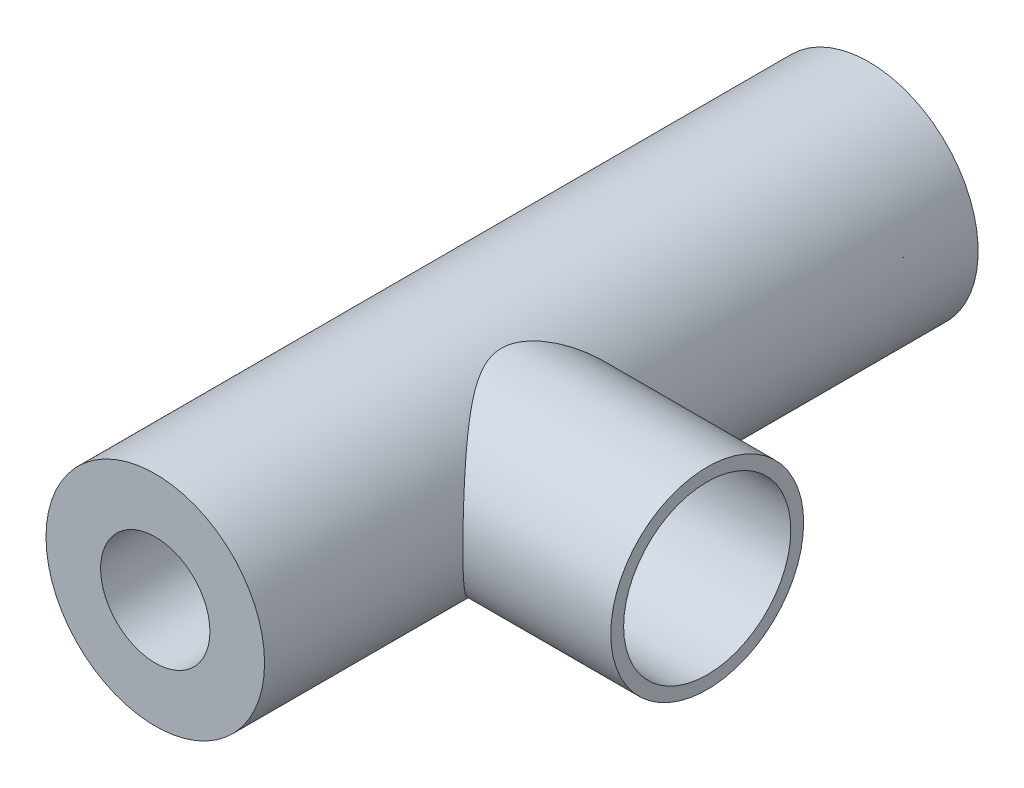
ISO-10303-21;
HEADER;
FILE_DESCRIPTION(('STEP AP214'),'2;1');
FILE_NAME('part.step','',(''),(''),'','','');
FILE_SCHEMA(('AUTOMOTIVE_DESIGN { 1 0 10303 214 1 1 1 1 }'));
ENDSEC;
DATA;
#1=APPLICATION_CONTEXT('core data for automotive mechanical design processes');
#2=APPLICATION_PROTOCOL_DEFINITION('international standard','automotive_design',2000,#1);
#3=PRODUCT_CONTEXT('',#1,'mechanical');
#4=PRODUCT('Part','Part','',(#3));
#5=PRODUCT_RELATED_PRODUCT_CATEGORY('part','',(#4));
#6=PRODUCT_DEFINITION_FORMATION('','',#4);
#7=PRODUCT_DEFINITION_CONTEXT('part definition',#1,'design');
#8=PRODUCT_DEFINITION('design','',#6,#7);
#9=PRODUCT_DEFINITION_SHAPE('','',#8);
#10=(LENGTH_UNIT() NAMED_UNIT(*) SI_UNIT(.MILLI.,.METRE.));
#11=(NAMED_UNIT(*) PLANE_ANGLE_UNIT() SI_UNIT($,.RADIAN.));
#12=(NAMED_UNIT(*) SI_UNIT($,.STERADIAN.) SOLID_ANGLE_UNIT());
#13=UNCERTAINTY_MEASURE_WITH_UNIT(LENGTH_MEASURE(1.E-05),#10,'distance_accuracy_value','');
#14=(GEOMETRIC_REPRESENTATION_CONTEXT(3) GLOBAL_UNCERTAINTY_ASSIGNED_CONTEXT((#13)) GLOBAL_UNIT_ASSIGNED_CONTEXT((#10,
#11,#12)) REPRESENTATION_CONTEXT('',''));
#15=CARTESIAN_POINT('',(0.,0.,0.));
#16=DIRECTION('',(0.,0.,1.));
#17=DIRECTION('',(1.,0.,0.));
#18=AXIS2_PLACEMENT_3D('',#15,#16,#17);
#19=CARTESIAN_POINT('',(0.,0.,40.));
#20=DIRECTION('',(0.,0.,-1.));
#21=DIRECTION('',(-1.,0.,0.));
#22=AXIS2_PLACEMENT_3D('',#19,#20,#21);
#23=CYLINDRICAL_SURFACE('',#22,17.);
#24=CARTESIAN_POINT('',(17.,0.,35.148533521579));
#25=CARTESIAN_POINT('',(16.9999991302981,-0.350062969028345,35.1485326365752));
#26=CARTESIAN_POINT('',(16.9891653444857,-0.700137947487223,35.1362576028503));
#27=CARTESIAN_POINT('',(16.9460807365506,-1.39725887284022,35.0874017384682));
#28=CARTESIAN_POINT('',(16.9138288534935,-1.74430466882253,35.0508197037761));
#29=CARTESIAN_POINT('',(16.8286230490111,-2.43264872335066,34.9540419460553));
#30=CARTESIAN_POINT('',(16.7756599565189,-2.77394436575743,34.8938357620491));
#31=CARTESIAN_POINT('',(16.6501724362022,-3.4480913826469,34.7509104252288));
#32=CARTESIAN_POINT('',(16.5776478083794,-3.78094267075591,34.6681910422382));
#33=CARTESIAN_POINT('',(16.4149921748408,-4.43402605306581,34.4821997809237));
#34=CARTESIAN_POINT('',(16.3249739977953,-4.75432399503505,34.379059535401));
#35=CARTESIAN_POINT('',(16.1286563009096,-5.38282947299204,34.1534129336591));
#36=CARTESIAN_POINT('',(16.0223571596618,-5.69103728991045,34.0309070277607));
#37=CARTESIAN_POINT('',(15.7951549284394,-6.29420048565358,33.7680522317252));
#38=CARTESIAN_POINT('',(15.6742496032193,-6.5891538265906,33.6277006104105));
#39=CARTESIAN_POINT('',(15.4195507686398,-7.16495750260025,33.3306571284931));
#40=CARTESIAN_POINT('',(15.2857544012181,-7.44580468911481,33.173961643667));
#41=CARTESIAN_POINT('',(14.9525647573555,-8.09955996417689,32.7815759695317));
#42=CARTESIAN_POINT('',(14.7479422301565,-8.46564473889133,32.5389147038629));
#43=CARTESIAN_POINT('',(14.3214041581488,-9.16878467175514,32.0280287184052));
#44=CARTESIAN_POINT('',(14.0994823766256,-9.50582926730369,31.7597947713264));
#45=CARTESIAN_POINT('',(13.6420314172314,-10.1514445290334,31.1998314355125));
#46=CARTESIAN_POINT('',(13.4064727396035,-10.4599494069001,30.9080505283112));
#47=CARTESIAN_POINT('',(12.9263257225329,-11.0478102432138,30.3035156680166));
#48=CARTESIAN_POINT('',(12.6817385891012,-11.3271700758846,29.9907645115816));
#49=CARTESIAN_POINT('',(12.1822165195919,-11.862995920558,29.3382831989957));
#50=CARTESIAN_POINT('',(11.9271723672962,-12.118818678642,28.9981092375766));
#51=CARTESIAN_POINT('',(11.416843540912,-12.6007468771702,28.2972835695232));
#52=CARTESIAN_POINT('',(11.1615588172992,-12.8268432683654,27.936625674831));
#53=CARTESIAN_POINT('',(10.6573293126381,-13.2487415055619,27.1949915507721));
#54=CARTESIAN_POINT('',(10.4083734410591,-13.4445999098557,26.814055091824));
#55=CARTESIAN_POINT('',(9.92433695372352,-13.8057374904692,26.0296892610917));
#56=CARTESIAN_POINT('',(9.6892463012846,-13.9710389758638,25.6262765810827));
#57=CARTESIAN_POINT('',(9.35346771382335,-14.1961760706847,24.9981919900579));
#58=CARTESIAN_POINT('',(9.24338032322282,-14.2679936455798,24.782824941109));
#59=CARTESIAN_POINT('',(9.03189446245701,-14.4027986616648,24.3451915706748));
#60=CARTESIAN_POINT('',(8.93049740995452,-14.4657846632138,24.1229241315482));
#61=CARTESIAN_POINT('',(8.64320574806638,-14.6405244256128,23.4457582502832));
#62=CARTESIAN_POINT('',(8.47369440351665,-14.7383969147046,22.9795723029301));
#63=CARTESIAN_POINT('',(8.28177765746332,-14.8464302757218,22.2991484913904));
#64=CARTESIAN_POINT('',(8.23105962403715,-14.8745472958986,22.095519328463));
#65=CARTESIAN_POINT('',(8.14361574939807,-14.9226003270876,21.684361748842));
#66=CARTESIAN_POINT('',(8.10688286865328,-14.9425404543912,21.4768353492005));
#67=CARTESIAN_POINT('',(8.049020955044,-14.9737890596324,21.0592557002418));
#68=CARTESIAN_POINT('',(8.02786981232692,-14.9851097689419,20.8492064628273));
#69=CARTESIAN_POINT('',(8.00211040879179,-14.9988815293899,20.4277921199078));
#70=CARTESIAN_POINT('',(7.997501837022,-15.0013327472488,20.2164270392117));
#71=CARTESIAN_POINT('',(8.00506897455629,-14.9972960116896,19.7938078760591));
#72=CARTESIAN_POINT('',(8.01726693450736,-14.9907962077642,19.5825543118883));
#73=CARTESIAN_POINT('',(8.05786994493661,-14.969009772177,19.1620870018145));
#74=CARTESIAN_POINT('',(8.08627547586044,-14.9537228800369,18.9528733165671));
#75=CARTESIAN_POINT('',(8.15803184472445,-14.9146965564452,18.5375016306632));
#76=CARTESIAN_POINT('',(8.20140716488379,-14.8909432766111,18.3313492162056));
#77=CARTESIAN_POINT('',(8.30134627140615,-14.8354612997649,17.9233335076197));
#78=CARTESIAN_POINT('',(8.35791490494853,-14.8037296711987,17.7214718197036));
#79=CARTESIAN_POINT('',(8.51706610661316,-14.7129873844161,17.211250310507));
#80=CARTESIAN_POINT('',(8.62770691794222,-14.6486370611905,16.9063454082258));
#81=CARTESIAN_POINT('',(8.86952026428829,-14.5034990689989,16.3088462313718));
#82=CARTESIAN_POINT('',(9.00070614300793,-14.4227007069885,16.0162601154707));
#83=CARTESIAN_POINT('',(9.27836676152409,-14.2456702640599,15.4420000592149));
#84=CARTESIAN_POINT('',(9.42489344972101,-14.1493851089534,15.1603679357136));
#85=CARTESIAN_POINT('',(9.72835616185364,-13.9424825635222,14.6083103098096));
#86=CARTESIAN_POINT('',(9.88529115544604,-13.8318665908091,14.3378837024393));
#87=CARTESIAN_POINT('',(10.1804578637767,-13.6156600777041,13.8498710218233));
#88=CARTESIAN_POINT('',(10.3176623988277,-13.5120993265881,13.63075570322));
#89=CARTESIAN_POINT('',(10.5954026984048,-13.2954314857213,13.1994523243595));
#90=CARTESIAN_POINT('',(10.7359388536213,-13.1823232723428,12.987265083545));
#91=CARTESIAN_POINT('',(11.1606029539076,-12.8287356223965,12.3604667303405));
#92=CARTESIAN_POINT('',(11.4476994284271,-12.5740558074001,11.9557596052157));
#93=CARTESIAN_POINT('',(12.0208366532807,-12.0273224846743,11.1723765914905));
#94=CARTESIAN_POINT('',(12.306878033562,-11.735297129089,10.7936814215095));
#95=CARTESIAN_POINT('',(12.8712541304774,-11.1133715589206,10.0627493328625));
#96=CARTESIAN_POINT('',(13.1495922259204,-10.7834882871164,9.71050069427968));
#97=CARTESIAN_POINT('',(13.6352711166348,-10.1588064131729,9.10562663820936));
#98=CARTESIAN_POINT('',(13.8452299529554,-9.87122544370551,8.84763207719246));
#99=CARTESIAN_POINT('',(14.2534887356309,-9.27197199196801,8.3509936345893));
#100=CARTESIAN_POINT('',(14.4517887268062,-8.9602996023235,8.11234967861192));
#101=CARTESIAN_POINT('',(14.833283063124,-8.31351209447092,7.65686727869284));
#102=CARTESIAN_POINT('',(15.0164996218003,-7.97843284370101,7.43999666163044));
#103=CARTESIAN_POINT('',(15.3648594721147,-7.28502088236289,7.03020490397535));
#104=CARTESIAN_POINT('',(15.530006822732,-6.92669342308836,6.83727838338367));
#105=CARTESIAN_POINT('',(15.8080238020619,-6.26171790979262,6.51405608322565));
#106=CARTESIAN_POINT('',(15.9247506285131,-5.95901665454972,6.37894325909598));
#107=CARTESIAN_POINT('',(16.1426788339558,-5.34053942929647,6.12747729411739));
#108=CARTESIAN_POINT('',(16.2438835377691,-5.02476627772608,6.01112013555238));
#109=CARTESIAN_POINT('',(16.4290396903629,-4.38161919970281,5.79875834295632));
#110=CARTESIAN_POINT('',(16.5129967455842,-4.05424908360266,5.70274709505662));
#111=CARTESIAN_POINT('',(16.6621164059827,-3.38966570504614,5.53252143838692));
#112=CARTESIAN_POINT('',(16.727278795266,-3.05245232956951,5.4583072799993));
#113=CARTESIAN_POINT('',(16.8377916386816,-2.36843789882078,5.33259170825764));
#114=CARTESIAN_POINT('',(16.8830202525202,-2.02159128989148,5.28122995693643));
#115=CARTESIAN_POINT('',(16.9520727976307,-1.32302801396549,5.20286135899246));
#116=CARTESIAN_POINT('',(16.9758966809555,-0.971311336061517,5.17585456692544));
#117=CARTESIAN_POINT('',(17.0015771358905,-0.26613484749739,5.14674455822591));
#118=CARTESIAN_POINT('',(17.0034393080259,0.0873244957576473,5.14463499247319));
#119=CARTESIAN_POINT('',(16.985164148193,0.792922684566801,5.16534874963734));
#120=CARTESIAN_POINT('',(16.9650282842637,1.14506161666499,5.18817040876894));
#121=CARTESIAN_POINT('',(16.9062081271185,1.81136667137754,5.25490762734186));
#122=CARTESIAN_POINT('',(16.8694882095085,2.12593530963243,5.29658994574143));
#123=CARTESIAN_POINT('',(16.7791527756365,2.74940671472676,5.39927711925535));
#124=CARTESIAN_POINT('',(16.7255385741825,3.0583099205029,5.46028047070039));
#125=CARTESIAN_POINT('',(16.6023435784895,3.66867092051007,5.60071760318556));
#126=CARTESIAN_POINT('',(16.5327606777443,3.97012772663522,5.68015381580635));
#127=CARTESIAN_POINT('',(16.3787584323192,4.56403361881577,5.85638315344701));
#128=CARTESIAN_POINT('',(16.2943381950834,4.85648216172494,5.95317732266039));
#129=CARTESIAN_POINT('',(16.1068854507353,5.4469629929748,6.16873573589989));
#130=CARTESIAN_POINT('',(16.0030839257848,5.7444156913472,6.28841639883531));
#131=CARTESIAN_POINT('',(15.7819015773923,6.32681856879558,6.54439563099222));
#132=CARTESIAN_POINT('',(15.664520647682,6.61176865000584,6.68069433026181));
#133=CARTESIAN_POINT('',(15.417731560136,7.16841994411667,6.96855099496842));
#134=CARTESIAN_POINT('',(15.2883233192127,7.44012106547047,7.12010906582143));
#135=CARTESIAN_POINT('',(15.0189965181811,7.969822616795,7.43722923511615));
#136=CARTESIAN_POINT('',(14.8790757677403,8.22782017234021,7.60279425288413));
#137=CARTESIAN_POINT('',(14.516012410579,8.85874937199631,8.0351253521801));
#138=CARTESIAN_POINT('',(14.2870289710183,9.22267284475824,8.31020279353306));
#139=CARTESIAN_POINT('',(13.8132735013541,9.91819968160604,8.88649630733359));
#140=CARTESIAN_POINT('',(13.5684943975407,10.2497883960733,9.18772411173995));
#141=CARTESIAN_POINT('',(13.0669523102988,10.8820118338008,9.81504739670171));
#142=CARTESIAN_POINT('',(12.8101451135638,11.1825167840915,10.1412379635457));
#143=CARTESIAN_POINT('',(12.2904006585737,11.7513577682343,10.8157825953698));
#144=CARTESIAN_POINT('',(12.0274647718476,12.0197009185084,11.1641317311271));
#145=CARTESIAN_POINT('',(11.4947027051461,12.5304051102611,11.8907661131831));
#146=CARTESIAN_POINT('',(11.224856949733,12.7720280241582,12.2695550992888));
#147=CARTESIAN_POINT('',(10.6909213339554,13.2221763666286,13.0508187728421));
#148=CARTESIAN_POINT('',(10.4268355663613,13.4306788825643,13.4533095955998));
#149=CARTESIAN_POINT('',(10.0429668901545,13.7172993091294,14.0750375087092));
#150=CARTESIAN_POINT('',(9.91732078601141,13.8083097234611,14.2847908508064));
#151=CARTESIAN_POINT('',(9.67141492354297,13.9816422969616,14.7110122493223));
#152=CARTESIAN_POINT('',(9.55115572938246,14.0639635473432,14.9274810050391));
#153=CARTESIAN_POINT('',(9.31808006013281,14.2194581116226,15.3671833577078));
#154=CARTESIAN_POINT('',(9.20525322625248,14.2926442905481,15.5904068781906));
#155=CARTESIAN_POINT('',(8.98918407704626,14.429515294593,16.0442385186253));
#156=CARTESIAN_POINT('',(8.88593853446644,14.4932033233819,16.2748441166237));
#157=CARTESIAN_POINT('',(8.70394654528928,14.6031218893045,16.7143656422531));
#158=CARTESIAN_POINT('',(8.62375124485427,14.6505398530233,16.9223809046087));
#159=CARTESIAN_POINT('',(8.4749736806385,14.7371039101608,17.344230595648));
#160=CARTESIAN_POINT('',(8.40639023442218,14.7762508459192,17.5580644292492));
#161=CARTESIAN_POINT('',(8.28334442065508,14.8455782182063,17.9906088517324));
#162=CARTESIAN_POINT('',(8.22884535051594,14.8757819903869,18.2093051188714));
#163=CARTESIAN_POINT('',(8.13605936268356,14.926732899921,18.6511784127804));
#164=CARTESIAN_POINT('',(8.09776777105855,14.9474827637359,18.8743541282893));
#165=CARTESIAN_POINT('',(8.03896940161493,14.9791895206198,19.3264561371635));
#166=CARTESIAN_POINT('',(8.0186774263672,14.9900281819808,19.5554192021718));
#167=CARTESIAN_POINT('',(7.99783747924545,15.0011580279249,20.0144960521085));
#168=CARTESIAN_POINT('',(7.99728802018044,15.0014500069828,20.2446097490546));
#169=CARTESIAN_POINT('',(8.01597265101576,14.991473869579,20.7040072834842));
#170=CARTESIAN_POINT('',(8.03522540300084,14.98119579164,20.9332901334171));
#171=CARTESIAN_POINT('',(8.09241364112727,14.9503804937031,21.3888055733944));
#172=CARTESIAN_POINT('',(8.13035246014266,14.9298414435339,21.6150376118934));
#173=CARTESIAN_POINT('',(8.23170957363801,14.8742358417849,22.1053019322918));
#174=CARTESIAN_POINT('',(8.2985910623264,14.8371555759993,22.368385266968));
#175=CARTESIAN_POINT('',(8.45199611068145,14.7503051018903,22.8867228011668));
#176=CARTESIAN_POINT('',(8.53853639933586,14.7005240811769,23.14197012128));
#177=CARTESIAN_POINT('',(8.72747444461087,14.5891476395478,23.6447141067762));
#178=CARTESIAN_POINT('',(8.82991955031208,14.5275168063499,23.892184886373));
#179=CARTESIAN_POINT('',(9.0468819621408,14.3934093151854,24.3785909734333));
#180=CARTESIAN_POINT('',(9.16139648015043,14.3209351604852,24.6175282351976));
#181=CARTESIAN_POINT('',(9.49290739149433,14.1049174655336,25.2716573795216));
#182=CARTESIAN_POINT('',(9.71985257727185,13.9502077034024,25.6781430209714));
#183=CARTESIAN_POINT('',(10.1901800464178,13.6104635759935,26.4683712104822));
#184=CARTESIAN_POINT('',(10.433574545601,13.4254065250331,26.8520964498721));
#185=CARTESIAN_POINT('',(10.9285645573822,13.0256617571436,27.5991567891494));
#186=CARTESIAN_POINT('',(11.1801715401568,12.8109311136437,27.9624612569189));
#187=CARTESIAN_POINT('',(11.684849027749,12.352352344981,28.6688999435969));
#188=CARTESIAN_POINT('',(11.9379191180214,12.1085121164229,29.012039595127));
#189=CARTESIAN_POINT('',(12.4583017864451,11.5732330742054,29.7017542982602));
#190=CARTESIAN_POINT('',(12.7253592973386,11.2796496820607,30.0468632451193));
#191=CARTESIAN_POINT('',(13.2500802136358,10.658366232418,30.7129371864564));
#192=CARTESIAN_POINT('',(13.507741612173,10.3306589435345,31.0338970384402));
#193=CARTESIAN_POINT('',(14.0078417249106,9.64163873180934,31.6485966646657));
#194=CARTESIAN_POINT('',(14.2503142372929,9.28040520840542,31.9423976205482));
#195=CARTESIAN_POINT('',(14.7153421909371,8.52382877790176,32.5002539537243));
#196=CARTESIAN_POINT('',(14.9379070841878,8.12850223492239,32.7643234628621));
#197=CARTESIAN_POINT('',(15.294884223302,7.42776205419934,33.1847069485015));
#198=CARTESIAN_POINT('',(15.4357652821708,7.13077868954108,33.3496414553343));
#199=CARTESIAN_POINT('',(15.7030412895692,6.52113419191825,33.6611912285701));
#200=CARTESIAN_POINT('',(15.8294401068934,6.20847727822892,33.8078113884272));
#201=CARTESIAN_POINT('',(16.0656707890401,5.56869984724502,34.0808866166242));
#202=CARTESIAN_POINT('',(16.1755144631712,5.24158985725101,34.2073560628249));
#203=CARTESIAN_POINT('',(16.3767547419221,4.57420199097105,34.4384363555683));
#204=CARTESIAN_POINT('',(16.4681527277819,4.23392510291732,34.543048838813));
#205=CARTESIAN_POINT('',(16.6225670274187,3.57667736474082,34.7194416370989));
#206=CARTESIAN_POINT('',(16.6875023306659,3.26075585002567,34.7934529169988));
#207=CARTESIAN_POINT('',(16.7997484070706,2.6217638510421,34.9212272511512));
#208=CARTESIAN_POINT('',(16.8470607128001,2.29869399101453,34.9749920661282));
#209=CARTESIAN_POINT('',(16.9231397987153,1.6476406966443,35.0613830149642));
#210=CARTESIAN_POINT('',(16.9519107963098,1.31965839706571,35.0940139559457));
#211=CARTESIAN_POINT('',(16.9903418211158,0.66112105950591,35.1375902098252));
#212=CARTESIAN_POINT('',(17.000000821263,0.330565884218595,35.1485343572916));
#213=CARTESIAN_POINT('',(17.,0.,35.148533521579));
#214=B_SPLINE_CURVE_WITH_KNOTS('',3,(#24,#25,#26,#27,#28,#29,#30,#31,#32,#33,#34,#35,#36,#37,
#38,#39,#40,#41,#42,#43,#44,#45,#46,#47,#48,#49,#50,#51,#52,#53,#54,#55,#56,#57,#58,#59,#60,#61,
#62,#63,#64,#65,#66,#67,#68,#69,#70,#71,#72,#73,#74,#75,#76,#77,#78,#79,#80,#81,#82,#83,#84,#85,
#86,#87,#88,#89,#90,#91,#92,#93,#94,#95,#96,#97,#98,#99,#100,#101,#102,#103,#104,#105,#106,#107,
#108,#109,#110,#111,#112,#113,#114,#115,#116,#117,#118,#119,#120,#121,#122,#123,#124,#125,#126,
#127,#128,#129,#130,#131,#132,#133,#134,#135,#136,#137,#138,#139,#140,#141,#142,#143,#144,#145,
#146,#147,#148,#149,#150,#151,#152,#153,#154,#155,#156,#157,#158,#159,#160,#161,#162,#163,#164,
#165,#166,#167,#168,#169,#170,#171,#172,#173,#174,#175,#176,#177,#178,#179,#180,#181,#182,#183,
#184,#185,#186,#187,#188,#189,#190,#191,#192,#193,#194,#195,#196,#197,#198,#199,#200,#201,#202,
#203,#204,#205,#206,#207,#208,#209,#210,#211,#212,#213),.UNSPECIFIED.,.T.,.F.,(4,2,2,2,2,2,2,2,
2,2,2,2,2,2,2,2,2,2,2,2,2,2,2,2,2,2,2,2,2,2,2,2,2,2,2,2,2,2,2,2,2,2,2,2,2,2,2,2,2,2,2,2,2,2,2,2,
2,2,2,2,2,2,2,2,2,2,2,2,2,2,2,2,2,2,2,2,2,2,2,2,2,2,2,2,2,2,2,2,2,2,2,2,2,2,4),(0.,
1.04983122895355,2.09971446463749,3.15006312327509,4.20042252115222,5.2442196797098,
6.28799256982264,7.33192539569681,8.37609020599624,9.82756320987206,11.2795619396223,
12.7348284259106,14.1899012178372,15.677166551523,17.1648835927934,18.6497833283075,
20.1335946453903,20.8901435420877,21.6468156213176,23.1568453166834,23.7915095252772,
24.4258538471675,25.0592963173279,25.6927268805685,26.3269968669096,26.9612856560735,
27.5966167422559,28.2321816156875,29.2225436686263,30.2135516344888,31.2080311911267,
32.2024124483452,33.0376243089539,33.8729346019252,35.5440840831346,37.213981148687,
38.8831337684172,40.201159091025,41.5191793464004,42.8352224588034,44.1509693320715,
45.2042922009838,46.257389133234,47.3101432071265,48.3629093734943,49.4220239734377,
50.4811409458195,51.5399878236041,52.59876404356,53.5559849379857,54.5131313545014,
55.4704041053452,56.4277344616746,57.4377913533395,58.4478561499351,59.4579279248193,
60.4682107398368,61.9972566076592,63.5269920389765,65.0628760657068,66.5984196184375,
68.1692239877838,69.7411103484526,70.5235694969229,71.3061104007536,72.0875365014595,
72.8686984327688,73.5520272647314,74.2352864713885,74.9167467928138,75.5980104597923,
76.2872988222182,76.9765352608884,77.6664218484214,78.3564315297116,79.1770257678425,
79.9983209378766,80.8221097462115,81.6457086690006,83.1151155774282,84.5856259695311,
86.0582863532865,87.5305481499777,89.1066964213325,90.6831793854494,92.2560196978404,
93.8281092288635,94.9304484585073,96.0324925185833,97.1337466966156,98.2349183805079,
99.2265368749605,100.218069113843,101.20937573897,102.200735634713),.UNSPECIFIED.);
#215=CARTESIAN_POINT('',(17.,0.,35.148533521579));
#216=VERTEX_POINT('',#215);
#217=EDGE_CURVE('E10',#216,#216,#214,.T.);
#218=ORIENTED_EDGE('',*,*,#217,.F.);
#219=EDGE_LOOP('',(#218));
#220=FACE_BOUND('',#219,.T.);
#221=CARTESIAN_POINT('',(0.,0.,-45.));
#222=DIRECTION('',(0.,0.,-1.));
#223=DIRECTION('',(-1.,0.,0.));
#224=AXIS2_PLACEMENT_3D('',#221,#222,#223);
#225=CIRCLE('',#224,17.);
#226=CARTESIAN_POINT('',(-17.,0.,-45.));
#227=VERTEX_POINT('',#226);
#228=EDGE_CURVE('E99',#227,#227,#225,.T.);
#229=ORIENTED_EDGE('',*,*,#228,.F.);
#230=EDGE_LOOP('',(#229));
#231=FACE_BOUND('',#230,.T.);
#232=CARTESIAN_POINT('',(0.,0.,66.));
#233=DIRECTION('',(0.,0.,1.));
#234=DIRECTION('',(1.,0.,0.));
#235=AXIS2_PLACEMENT_3D('',#232,#233,#234);
#236=CIRCLE('',#235,17.);
#237=CARTESIAN_POINT('',(17.,0.,66.));
#238=VERTEX_POINT('',#237);
#239=EDGE_CURVE('E93',#238,#238,#236,.T.);
#240=ORIENTED_EDGE('',*,*,#239,.F.);
#241=EDGE_LOOP('',(#240));
#242=FACE_BOUND('',#241,.T.);
#243=ADVANCED_FACE('F36',(#220,#231,#242),#23,.T.);
#244=CARTESIAN_POINT('',(0.,0.,2.));
#245=DIRECTION('',(0.,0.,1.));
#246=DIRECTION('',(1.,0.,0.));
#247=AXIS2_PLACEMENT_3D('',#244,#245,#246);
#248=CYLINDRICAL_SURFACE('',#247,8.5);
#249=CARTESIAN_POINT('',(0.,0.,-45.));
#250=DIRECTION('',(0.,0.,-1.));
#251=DIRECTION('',(-1.,0.,0.));
#252=AXIS2_PLACEMENT_3D('',#249,#250,#251);
#253=CIRCLE('',#252,8.5);
#254=CARTESIAN_POINT('',(-8.5,0.,-45.));
#255=VERTEX_POINT('',#254);
#256=EDGE_CURVE('E88',#255,#255,#253,.T.);
#257=ORIENTED_EDGE('',*,*,#256,.T.);
#258=EDGE_LOOP('',(#257));
#259=FACE_BOUND('',#258,.T.);
#260=CARTESIAN_POINT('',(0.,0.,66.));
#261=DIRECTION('',(0.,0.,1.));
#262=DIRECTION('',(1.,0.,0.));
#263=AXIS2_PLACEMENT_3D('',#260,#261,#262);
#264=CIRCLE('',#263,8.5);
#265=CARTESIAN_POINT('',(8.5,0.,66.));
#266=VERTEX_POINT('',#265);
#267=EDGE_CURVE('E91',#266,#266,#264,.T.);
#268=ORIENTED_EDGE('',*,*,#267,.T.);
#269=EDGE_LOOP('',(#268));
#270=FACE_BOUND('',#269,.T.);
#271=ADVANCED_FACE('F77',(#259,#270),#248,.F.);
#272=CARTESIAN_POINT('',(40.,0.,20.148533521579));
#273=DIRECTION('',(-1.,0.,0.));
#274=DIRECTION('',(0.,0.,1.));
#275=AXIS2_PLACEMENT_3D('',#272,#273,#274);
#276=CYLINDRICAL_SURFACE('',#275,15.);
#277=CARTESIAN_POINT('',(40.,0.,20.148533521579));
#278=DIRECTION('',(1.,0.,0.));
#279=DIRECTION('',(0.,0.,-1.));
#280=AXIS2_PLACEMENT_3D('',#277,#278,#279);
#281=CIRCLE('',#280,15.);
#282=CARTESIAN_POINT('',(40.,0.,5.14853352157895));
#283=VERTEX_POINT('',#282);
#284=EDGE_CURVE('E52',#283,#283,#281,.T.);
#285=ORIENTED_EDGE('',*,*,#284,.F.);
#286=EDGE_LOOP('',(#285));
#287=FACE_BOUND('',#286,.T.);
#288=ORIENTED_EDGE('',*,*,#217,.T.);
#289=EDGE_LOOP('',(#288));
#290=FACE_BOUND('',#289,.T.);
#291=ADVANCED_FACE('F69',(#287,#290),#276,.T.);
#292=CARTESIAN_POINT('',(40.,0.,20.148533521579));
#293=DIRECTION('',(-1.,0.,0.));
#294=DIRECTION('',(0.,0.,1.));
#295=AXIS2_PLACEMENT_3D('',#292,#293,#294);
#296=CYLINDRICAL_SURFACE('',#295,13.);
#297=CARTESIAN_POINT('',(40.,0.,20.148533521579));
#298=DIRECTION('',(1.,0.,0.));
#299=DIRECTION('',(0.,0.,-1.));
#300=AXIS2_PLACEMENT_3D('',#297,#298,#299);
#301=CIRCLE('',#300,13.);
#302=CARTESIAN_POINT('',(40.,0.,7.14853352157895));
#303=VERTEX_POINT('',#302);
#304=EDGE_CURVE('E56',#303,#303,#301,.T.);
#305=ORIENTED_EDGE('',*,*,#304,.T.);
#306=EDGE_LOOP('',(#305));
#307=FACE_BOUND('',#306,.T.);
#308=CARTESIAN_POINT('',(17.,0.,33.148533521579));
#309=CARTESIAN_POINT('',(16.9999999593681,-0.316074841986615,33.1485334775138));
#310=CARTESIAN_POINT('',(16.9911669301447,-0.63215015594173,33.1369889612));
#311=CARTESIAN_POINT('',(16.956042788192,-1.26177496453516,33.0910064814557));
#312=CARTESIAN_POINT('',(16.9297444904566,-1.57532336587788,33.0565590960475));
#313=CARTESIAN_POINT('',(16.8602546489747,-2.19773354187861,32.9652828118273));
#314=CARTESIAN_POINT('',(16.8170368479837,-2.50658725320358,32.9084191243751));
#315=CARTESIAN_POINT('',(16.7146988614328,-3.11681921549184,32.773235756415));
#316=CARTESIAN_POINT('',(16.6555800524566,-3.41819811109998,32.6949179332258));
#317=CARTESIAN_POINT('',(16.5230966029181,-4.00981767289043,32.5185008642513));
#318=CARTESIAN_POINT('',(16.4498190187942,-4.30011404334134,32.4205223687813));
#319=CARTESIAN_POINT('',(16.2902208579189,-4.8699344228344,32.2057495756615));
#320=CARTESIAN_POINT('',(16.2039000345307,-5.14945822805085,32.0889549222111));
#321=CARTESIAN_POINT('',(16.0197961709039,-5.69643513828738,31.8378941151679));
#322=CARTESIAN_POINT('',(15.9220182059912,-5.96389351591629,31.7036356948575));
#323=CARTESIAN_POINT('',(15.7165273803661,-6.48610380141161,31.4188024695135));
#324=CARTESIAN_POINT('',(15.6088108207666,-6.74085092368753,31.2682215860077));
#325=CARTESIAN_POINT('',(15.3746513520778,-7.26006741101371,30.9371780892978));
#326=CARTESIAN_POINT('',(15.2473988334846,-7.52322913597028,30.7552384346556));
#327=CARTESIAN_POINT('',(14.9851026108755,-8.03298686979916,30.3745947134335));
#328=CARTESIAN_POINT('',(14.8500587147846,-8.27958246995472,30.1758902335072));
#329=CARTESIAN_POINT('',(14.574106898897,-8.75621742548683,29.7624986135828));
#330=CARTESIAN_POINT('',(14.4331907189982,-8.98623212578057,29.5477886005109));
#331=CARTESIAN_POINT('',(14.1478985380875,-9.42901527625571,29.103533075368));
#332=CARTESIAN_POINT('',(14.0035231278869,-9.6417866446497,28.8739900854563));
#333=CARTESIAN_POINT('',(13.68292963961,-10.0930330993844,28.35060656637));
#334=CARTESIAN_POINT('',(13.5064263546134,-10.3274459715326,28.0534253031337));
#335=CARTESIAN_POINT('',(13.156051279676,-10.7702384141026,27.4386314929121));
#336=CARTESIAN_POINT('',(12.9821803216449,-10.9786098994659,27.1210126468146));
#337=CARTESIAN_POINT('',(12.6424167972708,-11.3682024587805,26.4658992973148));
#338=CARTESIAN_POINT('',(12.4765174063463,-11.5494470481657,26.12842236602));
#339=CARTESIAN_POINT('',(12.1587438726127,-11.8835190859981,25.4334615109241));
#340=CARTESIAN_POINT('',(12.0068617265043,-12.0363628013932,25.0759891933347));
#341=CARTESIAN_POINT('',(11.7743126905905,-12.263030279025,24.4708681302285));
#342=CARTESIAN_POINT('',(11.6874111252253,-12.3457196750048,24.228910454055));
#343=CARTESIAN_POINT('',(11.5248869868341,-12.4975735117393,23.7369755095278));
#344=CARTESIAN_POINT('',(11.449266397331,-12.5667355746597,23.4869968402177));
#345=CARTESIAN_POINT('',(11.31190382728,-12.6905233811291,22.9802298727397));
#346=CARTESIAN_POINT('',(11.2501355259823,-12.7451767296594,22.7234555434749));
#347=CARTESIAN_POINT('',(11.1427117311917,-12.8392011553103,22.2039039618202));
#348=CARTESIAN_POINT('',(11.0970477384928,-12.8785802946428,21.9411299540237));
#349=CARTESIAN_POINT('',(11.0234596989126,-12.9416279052585,21.4082896531682));
#350=CARTESIAN_POINT('',(10.995731142586,-12.9651233702637,21.1381753781197));
#351=CARTESIAN_POINT('',(10.9602335105113,-12.9951465870987,20.5956880119536));
#352=CARTESIAN_POINT('',(10.9524636358617,-13.0016750180811,20.3233150116857));
#353=CARTESIAN_POINT('',(10.9573056467035,-12.9975943944208,19.7788417468945));
#354=CARTESIAN_POINT('',(10.9699206653646,-12.9869827053319,19.5067415307305));
#355=CARTESIAN_POINT('',(11.0148558784639,-12.9488920713135,18.9653872748502));
#356=CARTESIAN_POINT('',(11.0471761502397,-12.9214130601846,18.6961332463084));
#357=CARTESIAN_POINT('',(11.1248672649512,-12.8545552869738,18.1949814896475));
#358=CARTESIAN_POINT('',(11.1681822338133,-12.8170218733538,17.9625105379774));
#359=CARTESIAN_POINT('',(11.2672584084985,-12.7300132423892,17.5024765361271));
#360=CARTESIAN_POINT('',(11.3230240272174,-12.6805337904913,17.2749152575249));
#361=CARTESIAN_POINT('',(11.5065528874295,-12.5150442690794,16.6006018932176));
#362=CARTESIAN_POINT('',(11.6505340567459,-12.3819945806483,16.1623042709058));
#363=CARTESIAN_POINT('',(11.9402302712928,-12.1022318238313,15.386688636327));
#364=CARTESIAN_POINT('',(12.081217218971,-11.9620021068291,15.045137414953));
#365=CARTESIAN_POINT('',(12.3769714693622,-11.6557244164412,14.3798096045233));
#366=CARTESIAN_POINT('',(12.5317462552688,-11.4896623859258,14.0560428237705));
#367=CARTESIAN_POINT('',(12.8498754390817,-11.1327442171738,13.4259268622816));
#368=CARTESIAN_POINT('',(13.0132473885697,-10.9418360841305,13.119616200586));
#369=CARTESIAN_POINT('',(13.3436550416061,-10.5363783274217,12.5252733352105));
#370=CARTESIAN_POINT('',(13.5106901351989,-10.3218326161016,12.237238119092));
#371=CARTESIAN_POINT('',(13.8496462299233,-9.86261857259184,11.6711727031651));
#372=CARTESIAN_POINT('',(14.0215589708675,-9.61722508517114,11.3937253870054));
#373=CARTESIAN_POINT('',(14.3612267256239,-9.10221604205871,10.8594362063371));
#374=CARTESIAN_POINT('',(14.5289813169447,-8.83259803778722,10.6025964297874));
#375=CARTESIAN_POINT('',(14.8564005983472,-8.27001374910083,10.1112974675507));
#376=CARTESIAN_POINT('',(15.0160779227314,-7.97708589673322,9.87680278810744));
#377=CARTESIAN_POINT('',(15.3240725433369,-7.36811757935672,9.43158325051136));
#378=CARTESIAN_POINT('',(15.4723924607189,-7.05208248035184,9.22085290248119));
#379=CARTESIAN_POINT('',(15.7278306064449,-6.45904244742772,8.86237602567552));
#380=CARTESIAN_POINT('',(15.8374684000317,-6.18578226232034,8.71021894583697));
#381=CARTESIAN_POINT('',(16.0450410807174,-5.62546615715684,8.42449910615624));
#382=CARTESIAN_POINT('',(16.1429783448146,-5.33841305584588,8.29093256867541));
#383=CARTESIAN_POINT('',(16.325302613854,-4.75171735010897,8.04388774322502));
#384=CARTESIAN_POINT('',(16.4096939087028,-4.45207876948792,7.93040309430148));
#385=CARTESIAN_POINT('',(16.5632285428797,-3.84167701434563,7.72495915803375));
#386=CARTESIAN_POINT('',(16.6323717286967,-3.53091372786238,7.63300008739898));
#387=CARTESIAN_POINT('',(16.7542778339616,-2.89805475358495,7.47144166197287));
#388=CARTESIAN_POINT('',(16.8069228148347,-2.57589501119098,7.40200317946764));
#389=CARTESIAN_POINT('',(16.8938745120876,-1.92480043838614,7.28757002945841));
#390=CARTESIAN_POINT('',(16.9281811593303,-1.59586558243734,7.24257545411013));
#391=CARTESIAN_POINT('',(16.9775503618269,-0.934227332869199,7.17788767869173));
#392=CARTESIAN_POINT('',(16.9926217707765,-0.60152574421759,7.15818283810747));
#393=CARTESIAN_POINT('',(17.0031400138719,0.0647011105331101,7.14442673200647));
#394=CARTESIAN_POINT('',(16.9985887532436,0.398226293524338,7.15037297594621));
#395=CARTESIAN_POINT('',(16.9716081995528,1.02553863298746,7.18567934038717));
#396=CARTESIAN_POINT('',(16.9512486041349,1.31957361255843,7.21232907264895));
#397=CARTESIAN_POINT('',(16.8956166062867,1.90373453750885,7.28531385732104));
#398=CARTESIAN_POINT('',(16.8603455324716,2.19386082877718,7.33164715592416));
#399=CARTESIAN_POINT('',(16.7755972048896,2.76833185096049,7.44333839250759));
#400=CARTESIAN_POINT('',(16.7261183776754,3.05267593778451,7.50869843762892));
#401=CARTESIAN_POINT('',(16.6139019745696,3.61388561325894,7.65757162079674));
#402=CARTESIAN_POINT('',(16.5511637804418,3.89075085251868,7.74108560530085));
#403=CARTESIAN_POINT('',(16.4120737834293,4.4414160124999,7.92723740554959));
#404=CARTESIAN_POINT('',(16.335460051748,4.71502445641021,8.03024527072882));
#405=CARTESIAN_POINT('',(16.1708715865656,5.25184082235924,8.25304246623859));
#406=CARTESIAN_POINT('',(16.082892819761,5.51504500854486,8.37283775549447));
#407=CARTESIAN_POINT('',(15.8040523351076,6.28737647291293,8.75560713174945));
#408=CARTESIAN_POINT('',(15.5981799061844,6.77963170224763,9.04210526669394));
#409=CARTESIAN_POINT('',(15.1220691942748,7.78997308181915,9.72045107713483));
#410=CARTESIAN_POINT('',(14.8468081680652,8.2992378431364,10.1218545557282));
#411=CARTESIAN_POINT('',(14.4185993373104,9.01005006968501,10.7718378175725));
#412=CARTESIAN_POINT('',(14.2731111769979,9.23840197824427,10.9968020859716));
#413=CARTESIAN_POINT('',(13.9794031364879,9.67707937988469,11.461975661133));
#414=CARTESIAN_POINT('',(13.831183861753,9.88740881132588,11.7021816171354));
#415=CARTESIAN_POINT('',(13.5043336999225,10.3307032818153,12.2476479708621));
#416=CARTESIAN_POINT('',(13.325645838787,10.559577727749,12.5562063687134));
#417=CARTESIAN_POINT('',(12.9727083049806,10.9902846703487,13.1942655179927));
#418=CARTESIAN_POINT('',(12.7984602057806,11.192107684933,13.5237735533408));
#419=CARTESIAN_POINT('',(12.4604444793563,11.567236205172,14.2030004958926));
#420=CARTESIAN_POINT('',(12.2966608344722,11.7405859656958,14.552686875173));
#421=CARTESIAN_POINT('',(11.9862367707321,12.0573316744021,15.2725552912216));
#422=CARTESIAN_POINT('',(11.8395841815639,12.2007489450296,15.6427224990032));
#423=CARTESIAN_POINT('',(11.6225936943532,12.4067919326084,16.2583857126598));
#424=CARTESIAN_POINT('',(11.5444307550799,12.4794106654809,16.4978139594982));
#425=CARTESIAN_POINT('',(11.4000789209164,12.6114138673392,16.9837909359774));
#426=CARTESIAN_POINT('',(11.3338859107709,12.6708028863281,17.2303371845184));
#427=CARTESIAN_POINT('',(11.215803591257,12.7754444461521,17.7292681945947));
#428=CARTESIAN_POINT('',(11.1638857108412,12.8207252485292,17.9816401818051));
#429=CARTESIAN_POINT('',(11.0762387873222,12.8965230941636,18.4914057211216));
#430=CARTESIAN_POINT('',(11.0405096226576,12.9270402482816,18.7487992355059));
#431=CARTESIAN_POINT('',(10.9866371624098,12.9728594598171,19.2689697892226));
#432=CARTESIAN_POINT('',(10.9686421731724,12.9880332314384,19.5317737727672));
#433=CARTESIAN_POINT('',(10.9516602210817,13.0023562048661,20.0584291039376));
#434=CARTESIAN_POINT('',(10.9526724390402,13.001506097283,20.3222804059352));
#435=CARTESIAN_POINT('',(10.9736588951475,12.9837973301394,20.8488609033395));
#436=CARTESIAN_POINT('',(10.9936462965046,12.966927557631,21.1115891926059));
#437=CARTESIAN_POINT('',(11.0516052555817,12.9175636300315,21.633561992175));
#438=CARTESIAN_POINT('',(11.0895790776614,12.8850675076887,21.8928060596125));
#439=CARTESIAN_POINT('',(11.1879793969963,12.7997617507945,22.440442081574));
#440=CARTESIAN_POINT('',(11.2507341141594,12.7448122641517,22.7280801982312));
#441=CARTESIAN_POINT('',(11.3940088856773,12.6168835480378,23.2947519075782));
#442=CARTESIAN_POINT('',(11.4745320924929,12.5439011189116,23.5737839633673));
#443=CARTESIAN_POINT('',(11.6501846345508,12.3809354156207,24.1227779392823));
#444=CARTESIAN_POINT('',(11.7453454831513,12.2909153624674,24.3927187209796));
#445=CARTESIAN_POINT('',(11.9469576827212,12.0950390109506,24.9223985161798));
#446=CARTESIAN_POINT('',(12.0534100489599,11.9891812882019,25.1821366094327));
#447=CARTESIAN_POINT('',(12.31990873686,11.7162075151842,25.7951690962999));
#448=CARTESIAN_POINT('',(12.4840999014648,11.5417203254778,26.1433938454221));
#449=CARTESIAN_POINT('',(12.8223800231821,11.1647121099788,26.8192930449774));
#450=CARTESIAN_POINT('',(12.9964727366379,10.9621804025894,27.146959595775));
#451=CARTESIAN_POINT('',(13.3490908851682,10.5299408875861,27.7818784455714));
#452=CARTESIAN_POINT('',(13.5276206264495,10.3002057944383,28.0891097570598));
#453=CARTESIAN_POINT('',(13.884105130947,9.81439812937493,28.6822617933137));
#454=CARTESIAN_POINT('',(14.0620599693592,9.55832915870306,28.9681854227752));
#455=CARTESIAN_POINT('',(14.4163552039825,9.01530549790384,29.5228406442249));
#456=CARTESIAN_POINT('',(14.5926057678541,8.72786952560904,29.7911595139578));
#457=CARTESIAN_POINT('',(14.9358424358823,8.1265289117756,30.3031106980095));
#458=CARTESIAN_POINT('',(15.1028273205901,7.81262079989371,30.546739766393));
#459=CARTESIAN_POINT('',(15.4230471676701,7.15971993881992,31.0065972549232));
#460=CARTESIAN_POINT('',(15.5763067679882,6.82077421525644,31.2228750725875));
#461=CARTESIAN_POINT('',(15.8652462271817,6.11865179148896,31.6257164146766));
#462=CARTESIAN_POINT('',(16.0009338723065,5.7554859322074,31.8122931083248));
#463=CARTESIAN_POINT('',(16.2166290766064,5.10914243087373,32.1062128973086));
#464=CARTESIAN_POINT('',(16.3017309405538,4.83115380325036,32.2212891439534));
#465=CARTESIAN_POINT('',(16.4590096014534,4.26466277181669,32.4328327469609));
#466=CARTESIAN_POINT('',(16.5311894407503,3.9761628620708,32.5293044839591));
#467=CARTESIAN_POINT('',(16.6611247825901,3.39067342223899,32.7022712472547));
#468=CARTESIAN_POINT('',(16.7189076127419,3.09370118722586,32.7788041331827));
#469=CARTESIAN_POINT('',(16.8190147202228,2.49268992093256,32.9110223978768));
#470=CARTESIAN_POINT('',(16.8613447362463,2.18865355775739,32.966715516077));
#471=CARTESIAN_POINT('',(16.9300461186618,1.5719204909322,33.05695441369));
#472=CARTESIAN_POINT('',(16.9562218790975,1.25916380878997,33.0912410455767));
#473=CARTESIAN_POINT('',(16.9912008902213,0.630938656094763,33.137033309959));
#474=CARTESIAN_POINT('',(17.0000000405541,0.315469563128684,33.1485335655598));
#475=CARTESIAN_POINT('',(17.,0.,33.148533521579));
#476=B_SPLINE_CURVE_WITH_KNOTS('',3,(#308,#309,#310,#311,#312,#313,#314,#315,#316,#317,#318,
#319,#320,#321,#322,#323,#324,#325,#326,#327,#328,#329,#330,#331,#332,#333,#334,#335,#336,#337,
#338,#339,#340,#341,#342,#343,#344,#345,#346,#347,#348,#349,#350,#351,#352,#353,#354,#355,#356,
#357,#358,#359,#360,#361,#362,#363,#364,#365,#366,#367,#368,#369,#370,#371,#372,#373,#374,#375,
#376,#377,#378,#379,#380,#381,#382,#383,#384,#385,#386,#387,#388,#389,#390,#391,#392,#393,#394,
#395,#396,#397,#398,#399,#400,#401,#402,#403,#404,#405,#406,#407,#408,#409,#410,#411,#412,#413,
#414,#415,#416,#417,#418,#419,#420,#421,#422,#423,#424,#425,#426,#427,#428,#429,#430,#431,#432,
#433,#434,#435,#436,#437,#438,#439,#440,#441,#442,#443,#444,#445,#446,#447,#448,#449,#450,#451,
#452,#453,#454,#455,#456,#457,#458,#459,#460,#461,#462,#463,#464,#465,#466,#467,#468,#469,#470,
#471,#472,#473,#474,#475),.UNSPECIFIED.,.T.,.F.,(4,2,2,2,2,2,2,2,2,2,2,2,2,2,2,2,2,2,2,2,2,2,2,
2,2,2,2,2,2,2,2,2,2,2,2,2,2,2,2,2,2,2,2,2,2,2,2,2,2,2,2,2,2,2,2,2,2,2,2,2,2,2,2,2,2,2,2,2,2,2,2,
2,2,2,2,2,2,2,2,2,2,2,2,4),(0.,0.947894672472264,1.89617953942556,2.84594191332572,
3.79562209075041,4.73963891650218,5.68367359505911,6.62729165155973,7.57126232582468,
8.60323502234386,9.63523317018232,10.6687354858769,11.7020625277218,12.9536295115669,
14.2055841086525,15.4564470612726,16.7065913434463,17.5161854429133,18.3259217251666,
19.1341061390153,19.9418633851088,20.758282839793,21.5746696145247,22.3911818803071,
23.2076973506922,23.9252754586682,24.6431083034417,26.0790294543734,27.263244770773,
28.4481067686973,29.6354894120578,30.8226758216124,32.0464911758328,33.2704303710351,
34.4923918254815,35.7140704097527,36.7074192459149,37.7005659358191,38.6933974804288,
39.68623901997,40.6860240800918,41.6858129094671,42.6851413846756,43.6843728341605,
44.5711475509912,45.4578432726959,46.3446372300171,47.2314725444543,48.1372317148734,
49.0433132151302,50.8541530195998,52.959528143538,54.014961468842,55.0701635643423,
56.3398766595899,57.6100336578914,58.8781974274067,60.1454547121307,60.9312297059508,
61.7167340350046,62.5006545740094,63.2845692264428,64.0749852928198,64.8653672932686,
65.6562979878018,66.4473282812346,67.344448130052,68.2417272727882,69.1409659257342,
70.040285501769,71.3065546050624,72.5733073384271,73.8413415874119,75.1092026585941,
76.4003734520336,77.6917137743541,78.9806875231034,80.2690881504561,81.2061979424418,
82.1430868115333,83.0781835446683,84.0129326578369,84.9587889585222,85.9048684260855),.UNSPECIFIED.);
#477=CARTESIAN_POINT('',(17.,0.,33.148533521579));
#478=VERTEX_POINT('',#477);
#479=EDGE_CURVE('E48',#478,#478,#476,.T.);
#480=ORIENTED_EDGE('',*,*,#479,.F.);
#481=EDGE_LOOP('',(#480));
#482=FACE_BOUND('',#481,.T.);
#483=ADVANCED_FACE('F63',(#307,#482),#296,.F.);
#484=CARTESIAN_POINT('',(40.,0.,20.148533521579));
#485=DIRECTION('',(1.,0.,0.));
#486=DIRECTION('',(0.,0.,-1.));
#487=AXIS2_PLACEMENT_3D('',#484,#485,#486);
#488=PLANE('',#487);
#489=ORIENTED_EDGE('',*,*,#284,.T.);
#490=EDGE_LOOP('',(#489));
#491=FACE_BOUND('',#490,.T.);
#492=ORIENTED_EDGE('',*,*,#304,.F.);
#493=EDGE_LOOP('',(#492));
#494=FACE_BOUND('',#493,.T.);
#495=ADVANCED_FACE('F68',(#491,#494),#488,.T.);
#496=ORIENTED_EDGE('',*,*,#479,.T.);
#497=EDGE_LOOP('',(#496));
#498=FACE_BOUND('',#497,.T.);
#499=ADVANCED_FACE('F38',(#498),#23,.T.);
#500=CARTESIAN_POINT('',(0.,0.,-45.));
#501=DIRECTION('',(0.,0.,-1.));
#502=DIRECTION('',(-1.,0.,0.));
#503=AXIS2_PLACEMENT_3D('',#500,#501,#502);
#504=PLANE('',#503);
#505=ORIENTED_EDGE('',*,*,#228,.T.);
#506=EDGE_LOOP('',(#505));
#507=FACE_BOUND('',#506,.T.);
#508=ORIENTED_EDGE('',*,*,#256,.F.);
#509=EDGE_LOOP('',(#508));
#510=FACE_BOUND('',#509,.T.);
#511=ADVANCED_FACE('F71',(#507,#510),#504,.T.);
#512=CARTESIAN_POINT('',(0.,0.,66.));
#513=DIRECTION('',(0.,0.,1.));
#514=DIRECTION('',(1.,0.,0.));
#515=AXIS2_PLACEMENT_3D('',#512,#513,#514);
#516=PLANE('',#515);
#517=ORIENTED_EDGE('',*,*,#239,.T.);
#518=EDGE_LOOP('',(#517));
#519=FACE_BOUND('',#518,.T.);
#520=ORIENTED_EDGE('',*,*,#267,.F.);
#521=EDGE_LOOP('',(#520));
#522=FACE_BOUND('',#521,.T.);
#523=ADVANCED_FACE('F112',(#519,#522),#516,.T.);
#524=CLOSED_SHELL('',(#243,#271,#291,#483,#495,#499,#511,#523));
#525=MANIFOLD_SOLID_BREP('B2',#524);
#526=ADVANCED_BREP_SHAPE_REPRESENTATION('',(#18,#525),#14);
#527=SHAPE_DEFINITION_REPRESENTATION(#9,#526);
ENDSEC;
END-ISO-10303-21;
